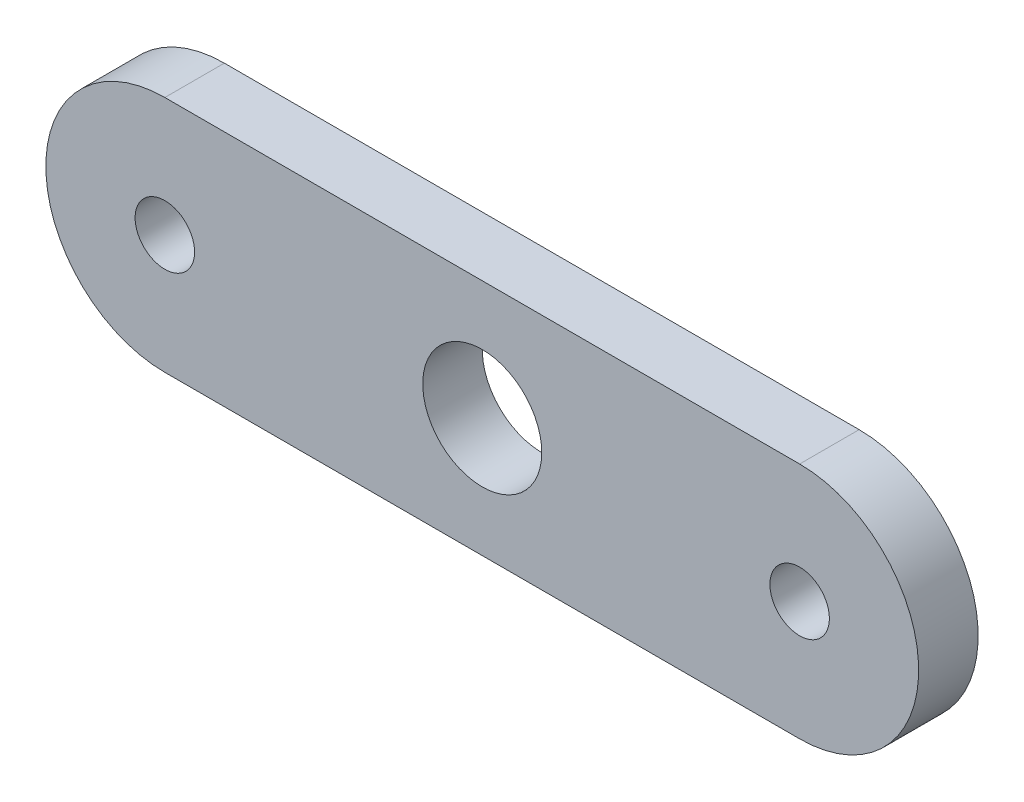
ISO-10303-21;
HEADER;
FILE_DESCRIPTION(('STEP AP214'),'2;1');
FILE_NAME('part.step','',(''),(''),'','','');
FILE_SCHEMA(('AUTOMOTIVE_DESIGN { 1 0 10303 214 1 1 1 1 }'));
ENDSEC;
DATA;
#1=APPLICATION_CONTEXT('core data for automotive mechanical design processes');
#2=APPLICATION_PROTOCOL_DEFINITION('international standard','automotive_design',2000,#1);
#3=PRODUCT_CONTEXT('',#1,'mechanical');
#4=PRODUCT('Part','Part','',(#3));
#5=PRODUCT_RELATED_PRODUCT_CATEGORY('part','',(#4));
#6=PRODUCT_DEFINITION_FORMATION('','',#4);
#7=PRODUCT_DEFINITION_CONTEXT('part definition',#1,'design');
#8=PRODUCT_DEFINITION('design','',#6,#7);
#9=PRODUCT_DEFINITION_SHAPE('','',#8);
#10=(LENGTH_UNIT() NAMED_UNIT(*) SI_UNIT(.MILLI.,.METRE.));
#11=(NAMED_UNIT(*) PLANE_ANGLE_UNIT() SI_UNIT($,.RADIAN.));
#12=(NAMED_UNIT(*) SI_UNIT($,.STERADIAN.) SOLID_ANGLE_UNIT());
#13=UNCERTAINTY_MEASURE_WITH_UNIT(LENGTH_MEASURE(1.E-05),#10,'distance_accuracy_value','');
#14=(GEOMETRIC_REPRESENTATION_CONTEXT(3) GLOBAL_UNCERTAINTY_ASSIGNED_CONTEXT((#13)) GLOBAL_UNIT_ASSIGNED_CONTEXT((#10,
#11,#12)) REPRESENTATION_CONTEXT('',''));
#15=CARTESIAN_POINT('',(0.,0.,0.));
#16=DIRECTION('',(0.,0.,1.));
#17=DIRECTION('',(1.,0.,0.));
#18=AXIS2_PLACEMENT_3D('',#15,#16,#17);
#19=CARTESIAN_POINT('',(0.,0.,3.));
#20=DIRECTION('',(0.,0.,1.));
#21=DIRECTION('',(1.,0.,0.));
#22=AXIS2_PLACEMENT_3D('',#19,#20,#21);
#23=PLANE('',#22);
#24=CARTESIAN_POINT('',(32.,0.,3.));
#25=DIRECTION('',(0.,0.,1.));
#26=DIRECTION('',(1.,0.,0.));
#27=AXIS2_PLACEMENT_3D('',#24,#25,#26);
#28=CIRCLE('',#27,1.5);
#29=CARTESIAN_POINT('',(33.5,0.,3.));
#30=VERTEX_POINT('',#29);
#31=EDGE_CURVE('E114',#30,#30,#28,.T.);
#32=ORIENTED_EDGE('',*,*,#31,.F.);
#33=EDGE_LOOP('',(#32));
#34=FACE_BOUND('',#33,.T.);
#35=CARTESIAN_POINT('',(0.,0.,3.));
#36=DIRECTION('',(0.,0.,1.));
#37=DIRECTION('',(1.,0.,0.));
#38=AXIS2_PLACEMENT_3D('',#35,#36,#37);
#39=CIRCLE('',#38,6.);
#40=CARTESIAN_POINT('',(0.,6.,3.));
#41=VERTEX_POINT('',#40);
#42=CARTESIAN_POINT('',(0.,-6.,3.));
#43=VERTEX_POINT('',#42);
#44=EDGE_CURVE('E84',#41,#43,#39,.T.);
#45=ORIENTED_EDGE('',*,*,#44,.T.);
#46=DIRECTION('',(1.,0.,0.));
#47=VECTOR('',#46,1.);
#48=CARTESIAN_POINT('',(0.,-6.,3.));
#49=LINE('',#48,#47);
#50=CARTESIAN_POINT('',(32.,-6.,3.));
#51=VERTEX_POINT('',#50);
#52=EDGE_CURVE('E79',#43,#51,#49,.T.);
#53=ORIENTED_EDGE('',*,*,#52,.T.);
#54=CARTESIAN_POINT('',(32.,0.,3.));
#55=DIRECTION('',(0.,0.,1.));
#56=DIRECTION('',(1.,0.,0.));
#57=AXIS2_PLACEMENT_3D('',#54,#55,#56);
#58=CIRCLE('',#57,6.);
#59=CARTESIAN_POINT('',(32.,6.,3.));
#60=VERTEX_POINT('',#59);
#61=EDGE_CURVE('E82',#51,#60,#58,.T.);
#62=ORIENTED_EDGE('',*,*,#61,.T.);
#63=DIRECTION('',(-1.,0.,0.));
#64=VECTOR('',#63,1.);
#65=CARTESIAN_POINT('',(0.,6.,3.));
#66=LINE('',#65,#64);
#67=EDGE_CURVE('E49',#60,#41,#66,.T.);
#68=ORIENTED_EDGE('',*,*,#67,.T.);
#69=EDGE_LOOP('',(#45,#53,#62,#68));
#70=FACE_BOUND('',#69,.T.);
#71=CARTESIAN_POINT('',(0.,0.,3.));
#72=DIRECTION('',(0.,0.,1.));
#73=DIRECTION('',(1.,0.,0.));
#74=AXIS2_PLACEMENT_3D('',#71,#72,#73);
#75=CIRCLE('',#74,1.5);
#76=CARTESIAN_POINT('',(1.5,0.,3.));
#77=VERTEX_POINT('',#76);
#78=EDGE_CURVE('E99',#77,#77,#75,.T.);
#79=ORIENTED_EDGE('',*,*,#78,.F.);
#80=EDGE_LOOP('',(#79));
#81=FACE_BOUND('',#80,.T.);
#82=CARTESIAN_POINT('',(16.,0.,3.));
#83=DIRECTION('',(0.,0.,1.));
#84=DIRECTION('',(1.,0.,0.));
#85=AXIS2_PLACEMENT_3D('',#82,#83,#84);
#86=CIRCLE('',#85,3.);
#87=CARTESIAN_POINT('',(19.,0.,3.));
#88=VERTEX_POINT('',#87);
#89=EDGE_CURVE('E120',#88,#88,#86,.T.);
#90=ORIENTED_EDGE('',*,*,#89,.F.);
#91=EDGE_LOOP('',(#90));
#92=FACE_BOUND('',#91,.T.);
#93=ADVANCED_FACE('F32',(#34,#70,#81,#92),#23,.T.);
#94=CARTESIAN_POINT('',(0.,0.,0.));
#95=DIRECTION('',(0.,0.,1.));
#96=DIRECTION('',(1.,0.,0.));
#97=AXIS2_PLACEMENT_3D('',#94,#95,#96);
#98=PLANE('',#97);
#99=CARTESIAN_POINT('',(0.,0.,0.));
#100=DIRECTION('',(0.,0.,1.));
#101=DIRECTION('',(1.,0.,0.));
#102=AXIS2_PLACEMENT_3D('',#99,#100,#101);
#103=CIRCLE('',#102,6.);
#104=CARTESIAN_POINT('',(0.,6.,0.));
#105=VERTEX_POINT('',#104);
#106=CARTESIAN_POINT('',(0.,-6.,0.));
#107=VERTEX_POINT('',#106);
#108=EDGE_CURVE('E96',#105,#107,#103,.T.);
#109=ORIENTED_EDGE('',*,*,#108,.F.);
#110=DIRECTION('',(-1.,0.,0.));
#111=VECTOR('',#110,1.);
#112=CARTESIAN_POINT('',(0.,6.,0.));
#113=LINE('',#112,#111);
#114=CARTESIAN_POINT('',(32.,6.,0.));
#115=VERTEX_POINT('',#114);
#116=EDGE_CURVE('E72',#115,#105,#113,.T.);
#117=ORIENTED_EDGE('',*,*,#116,.F.);
#118=CARTESIAN_POINT('',(32.,0.,0.));
#119=DIRECTION('',(0.,0.,1.));
#120=DIRECTION('',(1.,0.,0.));
#121=AXIS2_PLACEMENT_3D('',#118,#119,#120);
#122=CIRCLE('',#121,6.);
#123=CARTESIAN_POINT('',(32.,-6.,0.));
#124=VERTEX_POINT('',#123);
#125=EDGE_CURVE('E66',#124,#115,#122,.T.);
#126=ORIENTED_EDGE('',*,*,#125,.F.);
#127=DIRECTION('',(1.,0.,0.));
#128=VECTOR('',#127,1.);
#129=CARTESIAN_POINT('',(0.,-6.,0.));
#130=LINE('',#129,#128);
#131=EDGE_CURVE('E88',#107,#124,#130,.T.);
#132=ORIENTED_EDGE('',*,*,#131,.F.);
#133=EDGE_LOOP('',(#109,#117,#126,#132));
#134=FACE_BOUND('',#133,.T.);
#135=CARTESIAN_POINT('',(0.,0.,0.));
#136=DIRECTION('',(0.,0.,1.));
#137=DIRECTION('',(1.,0.,0.));
#138=AXIS2_PLACEMENT_3D('',#135,#136,#137);
#139=CIRCLE('',#138,1.5);
#140=CARTESIAN_POINT('',(1.5,0.,0.));
#141=VERTEX_POINT('',#140);
#142=EDGE_CURVE('E111',#141,#141,#139,.T.);
#143=ORIENTED_EDGE('',*,*,#142,.T.);
#144=EDGE_LOOP('',(#143));
#145=FACE_BOUND('',#144,.T.);
#146=CARTESIAN_POINT('',(32.,0.,0.));
#147=DIRECTION('',(0.,0.,1.));
#148=DIRECTION('',(1.,0.,0.));
#149=AXIS2_PLACEMENT_3D('',#146,#147,#148);
#150=CIRCLE('',#149,1.5);
#151=CARTESIAN_POINT('',(33.5,0.,0.));
#152=VERTEX_POINT('',#151);
#153=EDGE_CURVE('E117',#152,#152,#150,.T.);
#154=ORIENTED_EDGE('',*,*,#153,.T.);
#155=EDGE_LOOP('',(#154));
#156=FACE_BOUND('',#155,.T.);
#157=CARTESIAN_POINT('',(16.,0.,0.));
#158=DIRECTION('',(0.,0.,1.));
#159=DIRECTION('',(1.,0.,0.));
#160=AXIS2_PLACEMENT_3D('',#157,#158,#159);
#161=CIRCLE('',#160,3.);
#162=CARTESIAN_POINT('',(19.,0.,0.));
#163=VERTEX_POINT('',#162);
#164=EDGE_CURVE('E123',#163,#163,#161,.T.);
#165=ORIENTED_EDGE('',*,*,#164,.T.);
#166=EDGE_LOOP('',(#165));
#167=FACE_BOUND('',#166,.T.);
#168=ADVANCED_FACE('F107',(#134,#145,#156,#167),#98,.F.);
#169=CARTESIAN_POINT('',(0.,0.,3.));
#170=DIRECTION('',(0.,0.,-1.));
#171=DIRECTION('',(-1.,0.,0.));
#172=AXIS2_PLACEMENT_3D('',#169,#170,#171);
#173=CYLINDRICAL_SURFACE('',#172,6.);
#174=ORIENTED_EDGE('',*,*,#108,.T.);
#175=DIRECTION('',(0.,0.,-1.));
#176=VECTOR('',#175,1.);
#177=CARTESIAN_POINT('',(0.,-6.,3.));
#178=LINE('',#177,#176);
#179=EDGE_CURVE('E11',#43,#107,#178,.T.);
#180=ORIENTED_EDGE('',*,*,#179,.F.);
#181=ORIENTED_EDGE('',*,*,#44,.F.);
#182=DIRECTION('',(0.,0.,-1.));
#183=VECTOR('',#182,1.);
#184=CARTESIAN_POINT('',(0.,6.,3.));
#185=LINE('',#184,#183);
#186=EDGE_CURVE('E92',#41,#105,#185,.T.);
#187=ORIENTED_EDGE('',*,*,#186,.T.);
#188=EDGE_LOOP('',(#174,#180,#181,#187));
#189=FACE_BOUND('',#188,.T.);
#190=ADVANCED_FACE('F34',(#189),#173,.T.);
#191=CARTESIAN_POINT('',(0.,-6.,3.));
#192=DIRECTION('',(0.,1.,0.));
#193=DIRECTION('',(-1.,0.,0.));
#194=AXIS2_PLACEMENT_3D('',#191,#192,#193);
#195=PLANE('',#194);
#196=ORIENTED_EDGE('',*,*,#131,.T.);
#197=DIRECTION('',(0.,0.,-1.));
#198=VECTOR('',#197,1.);
#199=CARTESIAN_POINT('',(32.,-6.,3.));
#200=LINE('',#199,#198);
#201=EDGE_CURVE('E41',#51,#124,#200,.T.);
#202=ORIENTED_EDGE('',*,*,#201,.F.);
#203=ORIENTED_EDGE('',*,*,#52,.F.);
#204=ORIENTED_EDGE('',*,*,#179,.T.);
#205=EDGE_LOOP('',(#196,#202,#203,#204));
#206=FACE_BOUND('',#205,.T.);
#207=ADVANCED_FACE('F87',(#206),#195,.F.);
#208=CARTESIAN_POINT('',(32.,0.,3.));
#209=DIRECTION('',(0.,0.,-1.));
#210=DIRECTION('',(-1.,0.,0.));
#211=AXIS2_PLACEMENT_3D('',#208,#209,#210);
#212=CYLINDRICAL_SURFACE('',#211,6.);
#213=ORIENTED_EDGE('',*,*,#125,.T.);
#214=DIRECTION('',(0.,0.,-1.));
#215=VECTOR('',#214,1.);
#216=CARTESIAN_POINT('',(32.,6.,3.));
#217=LINE('',#216,#215);
#218=EDGE_CURVE('E89',#60,#115,#217,.T.);
#219=ORIENTED_EDGE('',*,*,#218,.F.);
#220=ORIENTED_EDGE('',*,*,#61,.F.);
#221=ORIENTED_EDGE('',*,*,#201,.T.);
#222=EDGE_LOOP('',(#213,#219,#220,#221));
#223=FACE_BOUND('',#222,.T.);
#224=ADVANCED_FACE('F90',(#223),#212,.T.);
#225=CARTESIAN_POINT('',(0.,6.,3.));
#226=DIRECTION('',(0.,-1.,0.));
#227=DIRECTION('',(1.,0.,0.));
#228=AXIS2_PLACEMENT_3D('',#225,#226,#227);
#229=PLANE('',#228);
#230=ORIENTED_EDGE('',*,*,#116,.T.);
#231=ORIENTED_EDGE('',*,*,#186,.F.);
#232=ORIENTED_EDGE('',*,*,#67,.F.);
#233=ORIENTED_EDGE('',*,*,#218,.T.);
#234=EDGE_LOOP('',(#230,#231,#232,#233));
#235=FACE_BOUND('',#234,.T.);
#236=ADVANCED_FACE('F104',(#235),#229,.F.);
#237=CARTESIAN_POINT('',(0.,0.,3.));
#238=DIRECTION('',(0.,0.,-1.));
#239=DIRECTION('',(-1.,0.,0.));
#240=AXIS2_PLACEMENT_3D('',#237,#238,#239);
#241=CYLINDRICAL_SURFACE('',#240,1.5);
#242=ORIENTED_EDGE('',*,*,#78,.T.);
#243=EDGE_LOOP('',(#242));
#244=FACE_BOUND('',#243,.T.);
#245=ORIENTED_EDGE('',*,*,#142,.F.);
#246=EDGE_LOOP('',(#245));
#247=FACE_BOUND('',#246,.T.);
#248=ADVANCED_FACE('F141',(#244,#247),#241,.F.);
#249=CARTESIAN_POINT('',(32.,0.,3.));
#250=DIRECTION('',(0.,0.,-1.));
#251=DIRECTION('',(-1.,0.,0.));
#252=AXIS2_PLACEMENT_3D('',#249,#250,#251);
#253=CYLINDRICAL_SURFACE('',#252,1.5);
#254=ORIENTED_EDGE('',*,*,#31,.T.);
#255=EDGE_LOOP('',(#254));
#256=FACE_BOUND('',#255,.T.);
#257=ORIENTED_EDGE('',*,*,#153,.F.);
#258=EDGE_LOOP('',(#257));
#259=FACE_BOUND('',#258,.T.);
#260=ADVANCED_FACE('F187',(#256,#259),#253,.F.);
#261=CARTESIAN_POINT('',(16.,0.,3.));
#262=DIRECTION('',(0.,0.,-1.));
#263=DIRECTION('',(-1.,0.,0.));
#264=AXIS2_PLACEMENT_3D('',#261,#262,#263);
#265=CYLINDRICAL_SURFACE('',#264,3.);
#266=ORIENTED_EDGE('',*,*,#89,.T.);
#267=EDGE_LOOP('',(#266));
#268=FACE_BOUND('',#267,.T.);
#269=ORIENTED_EDGE('',*,*,#164,.F.);
#270=EDGE_LOOP('',(#269));
#271=FACE_BOUND('',#270,.T.);
#272=ADVANCED_FACE('F129',(#268,#271),#265,.F.);
#273=CLOSED_SHELL('',(#93,#168,#190,#207,#224,#236,#248,#260,#272));
#274=MANIFOLD_SOLID_BREP('B2',#273);
#275=ADVANCED_BREP_SHAPE_REPRESENTATION('',(#18,#274),#14);
#276=SHAPE_DEFINITION_REPRESENTATION(#9,#275);
ENDSEC;
END-ISO-10303-21;
